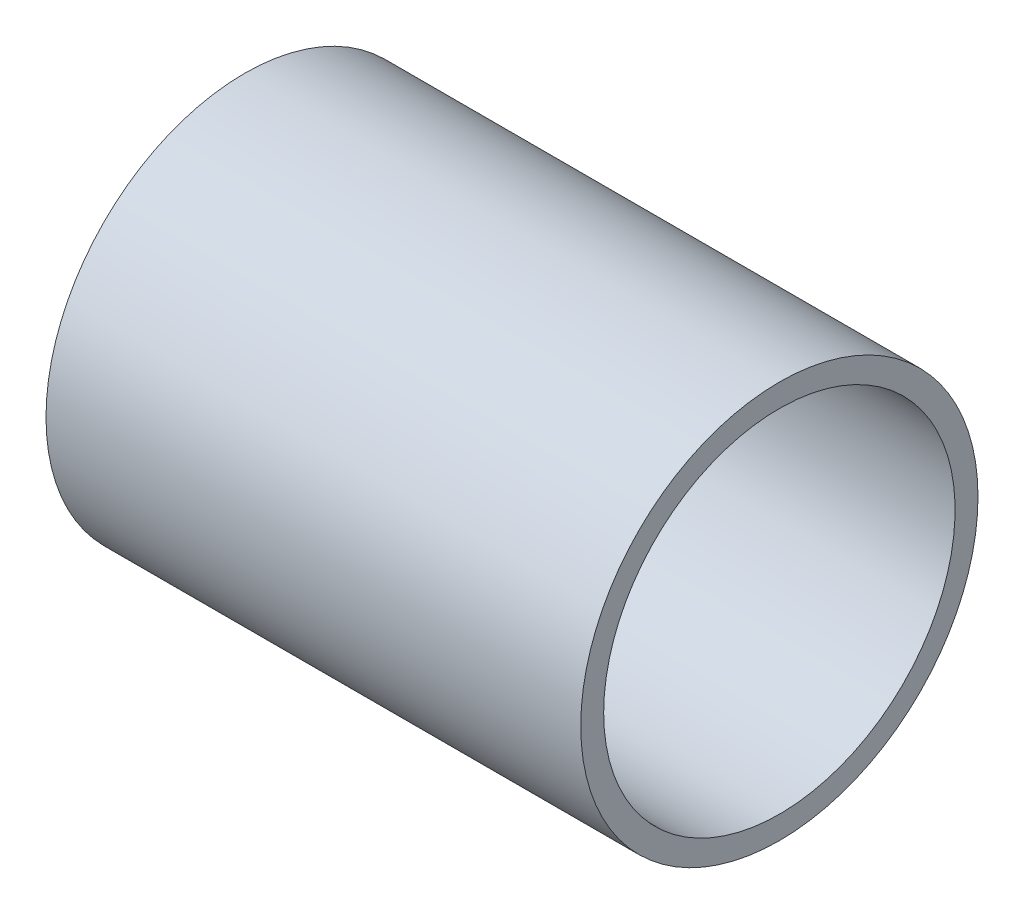
ISO-10303-21;
HEADER;
FILE_DESCRIPTION(('STEP AP214'),'2;1');
FILE_NAME('part.step','',(''),(''),'','','');
FILE_SCHEMA(('AUTOMOTIVE_DESIGN { 1 0 10303 214 1 1 1 1 }'));
ENDSEC;
DATA;
#1=APPLICATION_CONTEXT('core data for automotive mechanical design processes');
#2=APPLICATION_PROTOCOL_DEFINITION('international standard','automotive_design',2000,#1);
#3=PRODUCT_CONTEXT('',#1,'mechanical');
#4=PRODUCT('Part','Part','',(#3));
#5=PRODUCT_RELATED_PRODUCT_CATEGORY('part','',(#4));
#6=PRODUCT_DEFINITION_FORMATION('','',#4);
#7=PRODUCT_DEFINITION_CONTEXT('part definition',#1,'design');
#8=PRODUCT_DEFINITION('design','',#6,#7);
#9=PRODUCT_DEFINITION_SHAPE('','',#8);
#10=(LENGTH_UNIT() NAMED_UNIT(*) SI_UNIT(.MILLI.,.METRE.));
#11=(NAMED_UNIT(*) PLANE_ANGLE_UNIT() SI_UNIT($,.RADIAN.));
#12=(NAMED_UNIT(*) SI_UNIT($,.STERADIAN.) SOLID_ANGLE_UNIT());
#13=UNCERTAINTY_MEASURE_WITH_UNIT(LENGTH_MEASURE(1.E-05),#10,'distance_accuracy_value','');
#14=(GEOMETRIC_REPRESENTATION_CONTEXT(3) GLOBAL_UNCERTAINTY_ASSIGNED_CONTEXT((#13)) GLOBAL_UNIT_ASSIGNED_CONTEXT((#10,
#11,#12)) REPRESENTATION_CONTEXT('',''));
#15=CARTESIAN_POINT('',(0.,0.,0.));
#16=DIRECTION('',(0.,0.,1.));
#17=DIRECTION('',(1.,0.,0.));
#18=AXIS2_PLACEMENT_3D('',#15,#16,#17);
#19=CARTESIAN_POINT('',(0.,23.,0.));
#20=DIRECTION('',(1.,0.,0.));
#21=DIRECTION('',(0.,0.,-1.));
#22=AXIS2_PLACEMENT_3D('',#19,#20,#21);
#23=PLANE('',#22);
#24=CARTESIAN_POINT('',(0.,0.,0.));
#25=DIRECTION('',(-1.,0.,0.));
#26=DIRECTION('',(0.,0.,1.));
#27=AXIS2_PLACEMENT_3D('',#24,#25,#26);
#28=CIRCLE('',#27,23.);
#29=CARTESIAN_POINT('',(0.,0.,23.));
#30=VERTEX_POINT('',#29);
#31=EDGE_CURVE('E57',#30,#30,#28,.T.);
#32=ORIENTED_EDGE('',*,*,#31,.F.);
#33=EDGE_LOOP('',(#32));
#34=FACE_BOUND('',#33,.T.);
#35=CARTESIAN_POINT('',(0.,0.,0.));
#36=DIRECTION('',(-1.,0.,0.));
#37=DIRECTION('',(0.,0.,1.));
#38=AXIS2_PLACEMENT_3D('',#35,#36,#37);
#39=CIRCLE('',#38,26.);
#40=CARTESIAN_POINT('',(0.,0.,26.));
#41=VERTEX_POINT('',#40);
#42=EDGE_CURVE('E10',#41,#41,#39,.T.);
#43=ORIENTED_EDGE('',*,*,#42,.T.);
#44=EDGE_LOOP('',(#43));
#45=FACE_BOUND('',#44,.T.);
#46=ADVANCED_FACE('F43',(#34,#45),#23,.F.);
#47=CARTESIAN_POINT('',(0.,0.,0.));
#48=DIRECTION('',(-1.,0.,0.));
#49=DIRECTION('',(0.,0.,1.));
#50=AXIS2_PLACEMENT_3D('',#47,#48,#49);
#51=CYLINDRICAL_SURFACE('',#50,26.);
#52=ORIENTED_EDGE('',*,*,#42,.F.);
#53=EDGE_LOOP('',(#52));
#54=FACE_BOUND('',#53,.T.);
#55=CARTESIAN_POINT('',(70.,0.,0.));
#56=DIRECTION('',(-1.,0.,0.));
#57=DIRECTION('',(0.,0.,1.));
#58=AXIS2_PLACEMENT_3D('',#55,#56,#57);
#59=CIRCLE('',#58,26.);
#60=CARTESIAN_POINT('',(70.,0.,26.));
#61=VERTEX_POINT('',#60);
#62=EDGE_CURVE('E49',#61,#61,#59,.T.);
#63=ORIENTED_EDGE('',*,*,#62,.T.);
#64=EDGE_LOOP('',(#63));
#65=FACE_BOUND('',#64,.T.);
#66=ADVANCED_FACE('F66',(#54,#65),#51,.T.);
#67=CARTESIAN_POINT('',(70.,26.,0.));
#68=DIRECTION('',(-1.,0.,0.));
#69=DIRECTION('',(0.,0.,1.));
#70=AXIS2_PLACEMENT_3D('',#67,#68,#69);
#71=PLANE('',#70);
#72=ORIENTED_EDGE('',*,*,#62,.F.);
#73=EDGE_LOOP('',(#72));
#74=FACE_BOUND('',#73,.T.);
#75=CARTESIAN_POINT('',(70.,0.,0.));
#76=DIRECTION('',(-1.,0.,0.));
#77=DIRECTION('',(0.,0.,1.));
#78=AXIS2_PLACEMENT_3D('',#75,#76,#77);
#79=CIRCLE('',#78,23.);
#80=CARTESIAN_POINT('',(70.,0.,23.));
#81=VERTEX_POINT('',#80);
#82=EDGE_CURVE('E53',#81,#81,#79,.T.);
#83=ORIENTED_EDGE('',*,*,#82,.T.);
#84=EDGE_LOOP('',(#83));
#85=FACE_BOUND('',#84,.T.);
#86=ADVANCED_FACE('F70',(#74,#85),#71,.F.);
#87=CARTESIAN_POINT('',(0.,0.,0.));
#88=DIRECTION('',(-1.,0.,0.));
#89=DIRECTION('',(0.,0.,1.));
#90=AXIS2_PLACEMENT_3D('',#87,#88,#89);
#91=CYLINDRICAL_SURFACE('',#90,23.);
#92=ORIENTED_EDGE('',*,*,#82,.F.);
#93=EDGE_LOOP('',(#92));
#94=FACE_BOUND('',#93,.T.);
#95=ORIENTED_EDGE('',*,*,#31,.T.);
#96=EDGE_LOOP('',(#95));
#97=FACE_BOUND('',#96,.T.);
#98=ADVANCED_FACE('F63',(#94,#97),#91,.F.);
#99=CLOSED_SHELL('',(#46,#66,#86,#98));
#100=MANIFOLD_SOLID_BREP('B2',#99);
#101=ADVANCED_BREP_SHAPE_REPRESENTATION('',(#18,#100),#14);
#102=SHAPE_DEFINITION_REPRESENTATION(#9,#101);
ENDSEC;
END-ISO-10303-21;
